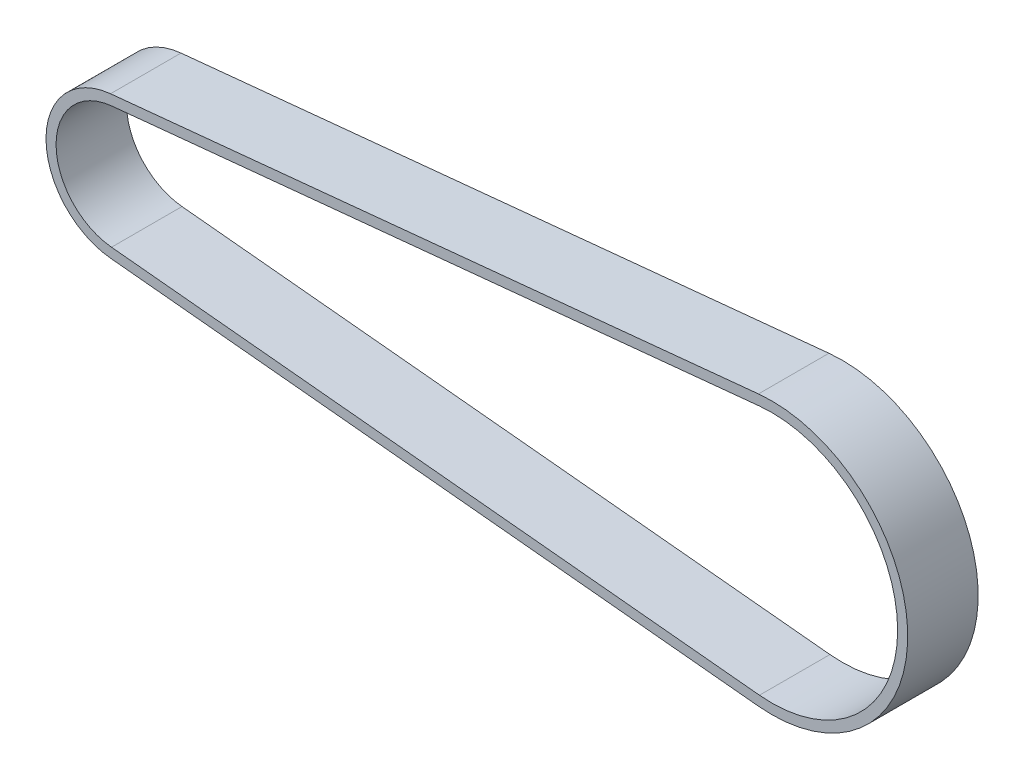
ISO-10303-21;
HEADER;
FILE_DESCRIPTION(('STEP AP214'),'2;1');
FILE_NAME('part.step','',(''),(''),'','','');
FILE_SCHEMA(('AUTOMOTIVE_DESIGN { 1 0 10303 214 1 1 1 1 }'));
ENDSEC;
DATA;
#1=APPLICATION_CONTEXT('core data for automotive mechanical design processes');
#2=APPLICATION_PROTOCOL_DEFINITION('international standard','automotive_design',2000,#1);
#3=PRODUCT_CONTEXT('',#1,'mechanical');
#4=PRODUCT('Part','Part','',(#3));
#5=PRODUCT_RELATED_PRODUCT_CATEGORY('part','',(#4));
#6=PRODUCT_DEFINITION_FORMATION('','',#4);
#7=PRODUCT_DEFINITION_CONTEXT('part definition',#1,'design');
#8=PRODUCT_DEFINITION('design','',#6,#7);
#9=PRODUCT_DEFINITION_SHAPE('','',#8);
#10=(LENGTH_UNIT() NAMED_UNIT(*) SI_UNIT(.MILLI.,.METRE.));
#11=(NAMED_UNIT(*) PLANE_ANGLE_UNIT() SI_UNIT($,.RADIAN.));
#12=(NAMED_UNIT(*) SI_UNIT($,.STERADIAN.) SOLID_ANGLE_UNIT());
#13=UNCERTAINTY_MEASURE_WITH_UNIT(LENGTH_MEASURE(1.E-05),#10,'distance_accuracy_value','');
#14=(GEOMETRIC_REPRESENTATION_CONTEXT(3) GLOBAL_UNCERTAINTY_ASSIGNED_CONTEXT((#13)) GLOBAL_UNIT_ASSIGNED_CONTEXT((#10,
#11,#12)) REPRESENTATION_CONTEXT('',''));
#15=CARTESIAN_POINT('',(0.,0.,0.));
#16=DIRECTION('',(0.,0.,1.));
#17=DIRECTION('',(1.,0.,0.));
#18=AXIS2_PLACEMENT_3D('',#15,#16,#17);
#19=CARTESIAN_POINT('',(0.,0.,7.));
#20=DIRECTION('',(0.,0.,1.));
#21=DIRECTION('',(1.,0.,0.));
#22=AXIS2_PLACEMENT_3D('',#19,#20,#21);
#23=PLANE('',#22);
#24=CARTESIAN_POINT('',(0.,0.,7.));
#25=DIRECTION('',(0.,0.,1.));
#26=DIRECTION('',(1.,0.,0.));
#27=AXIS2_PLACEMENT_3D('',#24,#25,#26);
#28=CIRCLE('',#27,7.11);
#29=CARTESIAN_POINT('',(-0.698967692307692,7.07555963617791,7.));
#30=VERTEX_POINT('',#29);
#31=CARTESIAN_POINT('',(-0.698967692307692,-7.07555963617791,7.));
#32=VERTEX_POINT('',#31);
#33=EDGE_CURVE('E134',#30,#32,#28,.T.);
#34=ORIENTED_EDGE('',*,*,#33,.T.);
#35=DIRECTION('',(0.995156066972983,-0.0983076923076923,0.));
#36=VECTOR('',#35,1.);
#37=CARTESIAN_POINT('',(-0.698967692307692,-7.07555963617791,7.));
#38=LINE('',#37,#36);
#39=CARTESIAN_POINT('',(63.6728461538462,-13.4346069041353,7.));
#40=VERTEX_POINT('',#39);
#41=EDGE_CURVE('E137',#32,#40,#38,.T.);
#42=ORIENTED_EDGE('',*,*,#41,.T.);
#43=CARTESIAN_POINT('',(65.,0.,7.));
#44=DIRECTION('',(0.,0.,1.));
#45=DIRECTION('',(1.,0.,0.));
#46=AXIS2_PLACEMENT_3D('',#43,#44,#45);
#47=CIRCLE('',#46,13.5);
#48=CARTESIAN_POINT('',(63.6728461538462,13.4346069041353,7.));
#49=VERTEX_POINT('',#48);
#50=EDGE_CURVE('E140',#40,#49,#47,.T.);
#51=ORIENTED_EDGE('',*,*,#50,.T.);
#52=DIRECTION('',(-0.995156066972983,-0.0983076923076923,0.));
#53=VECTOR('',#52,1.);
#54=CARTESIAN_POINT('',(-0.698967692307692,7.07555963617791,7.));
#55=LINE('',#54,#53);
#56=EDGE_CURVE('E142',#49,#30,#55,.T.);
#57=ORIENTED_EDGE('',*,*,#56,.T.);
#58=EDGE_LOOP('',(#34,#42,#51,#57));
#59=FACE_BOUND('',#58,.T.);
#60=DIRECTION('',(-0.995156066972983,-0.0983076923076922,0.));
#61=VECTOR('',#60,1.);
#62=CARTESIAN_POINT('',(-0.60066,6.08040356920492,7.));
#63=LINE('',#62,#61);
#64=CARTESIAN_POINT('',(63.7711538461539,12.4394508371623,7.));
#65=VERTEX_POINT('',#64);
#66=CARTESIAN_POINT('',(-0.60066,6.08040356920492,7.));
#67=VERTEX_POINT('',#66);
#68=EDGE_CURVE('E106',#65,#67,#63,.T.);
#69=ORIENTED_EDGE('',*,*,#68,.F.);
#70=CARTESIAN_POINT('',(65.,0.,7.));
#71=DIRECTION('',(0.,0.,1.));
#72=DIRECTION('',(1.,0.,0.));
#73=AXIS2_PLACEMENT_3D('',#70,#71,#72);
#74=CIRCLE('',#73,12.5);
#75=CARTESIAN_POINT('',(63.7711538461539,-12.4394508371623,7.));
#76=VERTEX_POINT('',#75);
#77=EDGE_CURVE('E98',#76,#65,#74,.T.);
#78=ORIENTED_EDGE('',*,*,#77,.F.);
#79=DIRECTION('',(0.995156066972983,-0.0983076923076922,0.));
#80=VECTOR('',#79,1.);
#81=CARTESIAN_POINT('',(-0.60066,-6.08040356920492,7.));
#82=LINE('',#81,#80);
#83=CARTESIAN_POINT('',(-0.600660000000002,-6.08040356920493,7.));
#84=VERTEX_POINT('',#83);
#85=EDGE_CURVE('E120',#84,#76,#82,.T.);
#86=ORIENTED_EDGE('',*,*,#85,.F.);
#87=CARTESIAN_POINT('',(0.,0.,7.));
#88=DIRECTION('',(0.,0.,1.));
#89=DIRECTION('',(1.,0.,0.));
#90=AXIS2_PLACEMENT_3D('',#87,#88,#89);
#91=CIRCLE('',#90,6.11);
#92=EDGE_CURVE('E118',#67,#84,#91,.T.);
#93=ORIENTED_EDGE('',*,*,#92,.F.);
#94=EDGE_LOOP('',(#69,#78,#86,#93));
#95=FACE_BOUND('',#94,.T.);
#96=ADVANCED_FACE('F33',(#59,#95),#23,.T.);
#97=CARTESIAN_POINT('',(0.,0.,0.));
#98=DIRECTION('',(0.,0.,1.));
#99=DIRECTION('',(1.,0.,0.));
#100=AXIS2_PLACEMENT_3D('',#97,#98,#99);
#101=PLANE('',#100);
#102=CARTESIAN_POINT('',(0.,0.,0.));
#103=DIRECTION('',(0.,0.,1.));
#104=DIRECTION('',(1.,0.,0.));
#105=AXIS2_PLACEMENT_3D('',#102,#103,#104);
#106=CIRCLE('',#105,7.11);
#107=CARTESIAN_POINT('',(-0.698967692307692,7.07555963617791,0.));
#108=VERTEX_POINT('',#107);
#109=CARTESIAN_POINT('',(-0.698967692307692,-7.07555963617791,0.));
#110=VERTEX_POINT('',#109);
#111=EDGE_CURVE('E114',#108,#110,#106,.T.);
#112=ORIENTED_EDGE('',*,*,#111,.F.);
#113=DIRECTION('',(-0.995156066972983,-0.0983076923076923,0.));
#114=VECTOR('',#113,1.);
#115=CARTESIAN_POINT('',(-0.698967692307692,7.07555963617791,0.));
#116=LINE('',#115,#114);
#117=CARTESIAN_POINT('',(63.6728461538462,13.4346069041353,0.));
#118=VERTEX_POINT('',#117);
#119=EDGE_CURVE('E138',#118,#108,#116,.T.);
#120=ORIENTED_EDGE('',*,*,#119,.F.);
#121=CARTESIAN_POINT('',(65.,0.,0.));
#122=DIRECTION('',(0.,0.,1.));
#123=DIRECTION('',(1.,0.,0.));
#124=AXIS2_PLACEMENT_3D('',#121,#122,#123);
#125=CIRCLE('',#124,13.5);
#126=CARTESIAN_POINT('',(63.6728461538462,-13.4346069041353,0.));
#127=VERTEX_POINT('',#126);
#128=EDGE_CURVE('E149',#127,#118,#125,.T.);
#129=ORIENTED_EDGE('',*,*,#128,.F.);
#130=DIRECTION('',(0.995156066972983,-0.0983076923076923,0.));
#131=VECTOR('',#130,1.);
#132=CARTESIAN_POINT('',(-0.698967692307692,-7.07555963617791,0.));
#133=LINE('',#132,#131);
#134=EDGE_CURVE('E147',#110,#127,#133,.T.);
#135=ORIENTED_EDGE('',*,*,#134,.F.);
#136=EDGE_LOOP('',(#112,#120,#129,#135));
#137=FACE_BOUND('',#136,.T.);
#138=CARTESIAN_POINT('',(65.,0.,0.));
#139=DIRECTION('',(0.,0.,1.));
#140=DIRECTION('',(1.,0.,0.));
#141=AXIS2_PLACEMENT_3D('',#138,#139,#140);
#142=CIRCLE('',#141,12.5);
#143=CARTESIAN_POINT('',(63.7711538461539,-12.4394508371623,0.));
#144=VERTEX_POINT('',#143);
#145=CARTESIAN_POINT('',(63.7711538461539,12.4394508371623,0.));
#146=VERTEX_POINT('',#145);
#147=EDGE_CURVE('E56',#144,#146,#142,.T.);
#148=ORIENTED_EDGE('',*,*,#147,.T.);
#149=DIRECTION('',(-0.995156066972983,-0.0983076923076922,0.));
#150=VECTOR('',#149,1.);
#151=CARTESIAN_POINT('',(-0.60066,6.08040356920492,0.));
#152=LINE('',#151,#150);
#153=CARTESIAN_POINT('',(-0.60066,6.08040356920492,0.));
#154=VERTEX_POINT('',#153);
#155=EDGE_CURVE('E113',#146,#154,#152,.T.);
#156=ORIENTED_EDGE('',*,*,#155,.T.);
#157=CARTESIAN_POINT('',(0.,0.,0.));
#158=DIRECTION('',(0.,0.,1.));
#159=DIRECTION('',(1.,0.,0.));
#160=AXIS2_PLACEMENT_3D('',#157,#158,#159);
#161=CIRCLE('',#160,6.11);
#162=CARTESIAN_POINT('',(-0.600660000000002,-6.08040356920492,0.));
#163=VERTEX_POINT('',#162);
#164=EDGE_CURVE('E126',#154,#163,#161,.T.);
#165=ORIENTED_EDGE('',*,*,#164,.T.);
#166=DIRECTION('',(0.995156066972983,-0.0983076923076922,0.));
#167=VECTOR('',#166,1.);
#168=CARTESIAN_POINT('',(-0.60066,-6.08040356920492,0.));
#169=LINE('',#168,#167);
#170=EDGE_CURVE('E107',#163,#144,#169,.T.);
#171=ORIENTED_EDGE('',*,*,#170,.T.);
#172=EDGE_LOOP('',(#148,#156,#165,#171));
#173=FACE_BOUND('',#172,.T.);
#174=ADVANCED_FACE('F167',(#137,#173),#101,.F.);
#175=CARTESIAN_POINT('',(0.,0.,7.));
#176=DIRECTION('',(0.,0.,-1.));
#177=DIRECTION('',(-1.,0.,0.));
#178=AXIS2_PLACEMENT_3D('',#175,#176,#177);
#179=CYLINDRICAL_SURFACE('',#178,7.11);
#180=ORIENTED_EDGE('',*,*,#111,.T.);
#181=DIRECTION('',(0.,0.,-1.));
#182=VECTOR('',#181,1.);
#183=CARTESIAN_POINT('',(-0.698967692307692,-7.07555963617791,7.));
#184=LINE('',#183,#182);
#185=EDGE_CURVE('E11',#32,#110,#184,.T.);
#186=ORIENTED_EDGE('',*,*,#185,.F.);
#187=ORIENTED_EDGE('',*,*,#33,.F.);
#188=DIRECTION('',(0.,0.,-1.));
#189=VECTOR('',#188,1.);
#190=CARTESIAN_POINT('',(-0.698967692307692,7.07555963617791,7.));
#191=LINE('',#190,#189);
#192=EDGE_CURVE('E144',#30,#108,#191,.T.);
#193=ORIENTED_EDGE('',*,*,#192,.T.);
#194=EDGE_LOOP('',(#180,#186,#187,#193));
#195=FACE_BOUND('',#194,.T.);
#196=ADVANCED_FACE('F35',(#195),#179,.T.);
#197=CARTESIAN_POINT('',(-0.698967692307692,-7.07555963617791,7.));
#198=DIRECTION('',(0.0983076923076923,0.995156066972983,0.));
#199=DIRECTION('',(-0.995156066972983,0.0983076923076924,0.));
#200=AXIS2_PLACEMENT_3D('',#197,#198,#199);
#201=PLANE('',#200);
#202=ORIENTED_EDGE('',*,*,#134,.T.);
#203=DIRECTION('',(0.,0.,-1.));
#204=VECTOR('',#203,1.);
#205=CARTESIAN_POINT('',(63.6728461538462,-13.4346069041353,7.));
#206=LINE('',#205,#204);
#207=EDGE_CURVE('E41',#40,#127,#206,.T.);
#208=ORIENTED_EDGE('',*,*,#207,.F.);
#209=ORIENTED_EDGE('',*,*,#41,.F.);
#210=ORIENTED_EDGE('',*,*,#185,.T.);
#211=EDGE_LOOP('',(#202,#208,#209,#210));
#212=FACE_BOUND('',#211,.T.);
#213=ADVANCED_FACE('F177',(#212),#201,.F.);
#214=CARTESIAN_POINT('',(65.,0.,7.));
#215=DIRECTION('',(0.,0.,-1.));
#216=DIRECTION('',(-1.,0.,0.));
#217=AXIS2_PLACEMENT_3D('',#214,#215,#216);
#218=CYLINDRICAL_SURFACE('',#217,13.5);
#219=ORIENTED_EDGE('',*,*,#128,.T.);
#220=DIRECTION('',(0.,0.,-1.));
#221=VECTOR('',#220,1.);
#222=CARTESIAN_POINT('',(63.6728461538462,13.4346069041353,7.));
#223=LINE('',#222,#221);
#224=EDGE_CURVE('E154',#49,#118,#223,.T.);
#225=ORIENTED_EDGE('',*,*,#224,.F.);
#226=ORIENTED_EDGE('',*,*,#50,.F.);
#227=ORIENTED_EDGE('',*,*,#207,.T.);
#228=EDGE_LOOP('',(#219,#225,#226,#227));
#229=FACE_BOUND('',#228,.T.);
#230=ADVANCED_FACE('F161',(#229),#218,.T.);
#231=CARTESIAN_POINT('',(-0.698967692307692,7.07555963617791,7.));
#232=DIRECTION('',(0.0983076923076923,-0.995156066972983,0.));
#233=DIRECTION('',(0.995156066972983,0.0983076923076923,0.));
#234=AXIS2_PLACEMENT_3D('',#231,#232,#233);
#235=PLANE('',#234);
#236=ORIENTED_EDGE('',*,*,#119,.T.);
#237=ORIENTED_EDGE('',*,*,#192,.F.);
#238=ORIENTED_EDGE('',*,*,#56,.F.);
#239=ORIENTED_EDGE('',*,*,#224,.T.);
#240=EDGE_LOOP('',(#236,#237,#238,#239));
#241=FACE_BOUND('',#240,.T.);
#242=ADVANCED_FACE('F171',(#241),#235,.F.);
#243=CARTESIAN_POINT('',(65.,0.,7.));
#244=DIRECTION('',(0.,0.,-1.));
#245=DIRECTION('',(-1.,0.,0.));
#246=AXIS2_PLACEMENT_3D('',#243,#244,#245);
#247=CYLINDRICAL_SURFACE('',#246,12.5);
#248=ORIENTED_EDGE('',*,*,#147,.F.);
#249=DIRECTION('',(0.,0.,-1.));
#250=VECTOR('',#249,1.);
#251=CARTESIAN_POINT('',(63.7711538461539,-12.4394508371623,7.));
#252=LINE('',#251,#250);
#253=EDGE_CURVE('E102',#76,#144,#252,.T.);
#254=ORIENTED_EDGE('',*,*,#253,.F.);
#255=ORIENTED_EDGE('',*,*,#77,.T.);
#256=DIRECTION('',(0.,0.,-1.));
#257=VECTOR('',#256,1.);
#258=CARTESIAN_POINT('',(63.7711538461539,12.4394508371623,7.));
#259=LINE('',#258,#257);
#260=EDGE_CURVE('E101',#65,#146,#259,.T.);
#261=ORIENTED_EDGE('',*,*,#260,.T.);
#262=EDGE_LOOP('',(#248,#254,#255,#261));
#263=FACE_BOUND('',#262,.T.);
#264=ADVANCED_FACE('F100',(#263),#247,.F.);
#265=CARTESIAN_POINT('',(-0.60066,6.08040356920492,7.));
#266=DIRECTION('',(0.0983076923076923,-0.995156066972983,0.));
#267=DIRECTION('',(0.995156066972983,0.0983076923076923,0.));
#268=AXIS2_PLACEMENT_3D('',#265,#266,#267);
#269=PLANE('',#268);
#270=ORIENTED_EDGE('',*,*,#155,.F.);
#271=ORIENTED_EDGE('',*,*,#260,.F.);
#272=ORIENTED_EDGE('',*,*,#68,.T.);
#273=DIRECTION('',(0.,0.,-1.));
#274=VECTOR('',#273,1.);
#275=CARTESIAN_POINT('',(-0.60066,6.08040356920492,7.));
#276=LINE('',#275,#274);
#277=EDGE_CURVE('E115',#67,#154,#276,.T.);
#278=ORIENTED_EDGE('',*,*,#277,.T.);
#279=EDGE_LOOP('',(#270,#271,#272,#278));
#280=FACE_BOUND('',#279,.T.);
#281=ADVANCED_FACE('F110',(#280),#269,.T.);
#282=CARTESIAN_POINT('',(0.,0.,7.));
#283=DIRECTION('',(0.,0.,-1.));
#284=DIRECTION('',(-1.,0.,0.));
#285=AXIS2_PLACEMENT_3D('',#282,#283,#284);
#286=CYLINDRICAL_SURFACE('',#285,6.11);
#287=ORIENTED_EDGE('',*,*,#164,.F.);
#288=ORIENTED_EDGE('',*,*,#277,.F.);
#289=ORIENTED_EDGE('',*,*,#92,.T.);
#290=DIRECTION('',(0.,0.,-1.));
#291=VECTOR('',#290,1.);
#292=CARTESIAN_POINT('',(-0.600660000000002,-6.08040356920492,7.));
#293=LINE('',#292,#291);
#294=EDGE_CURVE('E48',#84,#163,#293,.T.);
#295=ORIENTED_EDGE('',*,*,#294,.T.);
#296=EDGE_LOOP('',(#287,#288,#289,#295));
#297=FACE_BOUND('',#296,.T.);
#298=ADVANCED_FACE('F200',(#297),#286,.F.);
#299=CARTESIAN_POINT('',(-0.60066,-6.08040356920492,7.));
#300=DIRECTION('',(0.0983076923076923,0.995156066972983,0.));
#301=DIRECTION('',(-0.995156066972983,0.0983076923076923,0.));
#302=AXIS2_PLACEMENT_3D('',#299,#300,#301);
#303=PLANE('',#302);
#304=ORIENTED_EDGE('',*,*,#170,.F.);
#305=ORIENTED_EDGE('',*,*,#294,.F.);
#306=ORIENTED_EDGE('',*,*,#85,.T.);
#307=ORIENTED_EDGE('',*,*,#253,.T.);
#308=EDGE_LOOP('',(#304,#305,#306,#307));
#309=FACE_BOUND('',#308,.T.);
#310=ADVANCED_FACE('F204',(#309),#303,.T.);
#311=CLOSED_SHELL('',(#96,#174,#196,#213,#230,#242,#264,#281,#298,#310));
#312=MANIFOLD_SOLID_BREP('B2',#311);
#313=ADVANCED_BREP_SHAPE_REPRESENTATION('',(#18,#312),#14);
#314=SHAPE_DEFINITION_REPRESENTATION(#9,#313);
ENDSEC;
END-ISO-10303-21;
